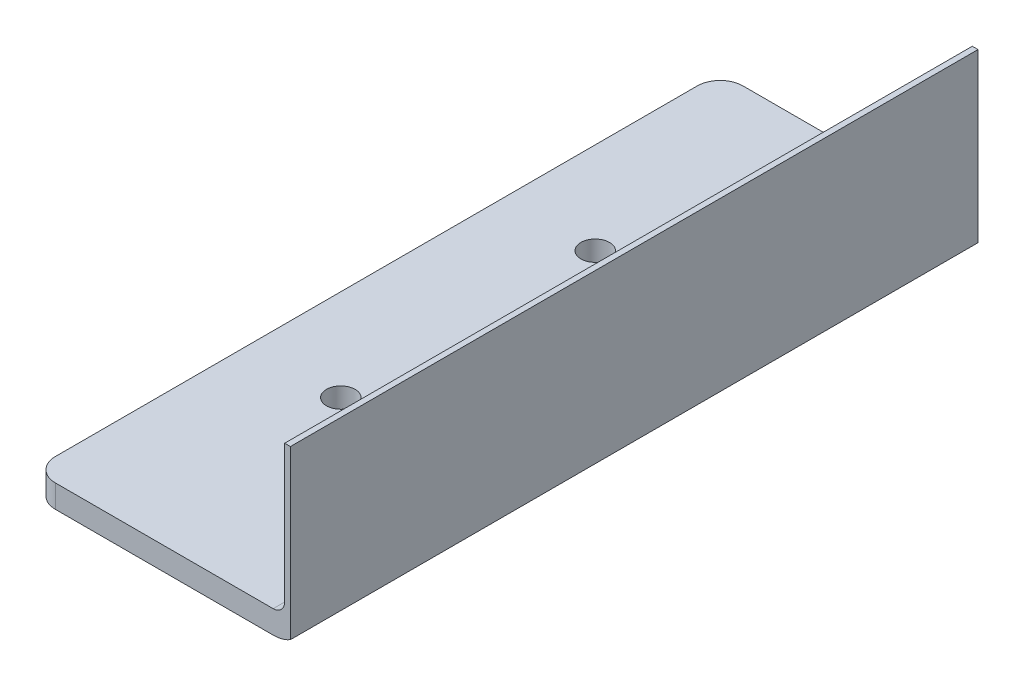
ISO-10303-21;
HEADER;
FILE_DESCRIPTION(('STEP AP214'),'2;1');
FILE_NAME('part.step','',(''),(''),'','','');
FILE_SCHEMA(('AUTOMOTIVE_DESIGN { 1 0 10303 214 1 1 1 1 }'));
ENDSEC;
DATA;
#1=APPLICATION_CONTEXT('core data for automotive mechanical design processes');
#2=APPLICATION_PROTOCOL_DEFINITION('international standard','automotive_design',2000,#1);
#3=PRODUCT_CONTEXT('',#1,'mechanical');
#4=PRODUCT('Part','Part','',(#3));
#5=PRODUCT_RELATED_PRODUCT_CATEGORY('part','',(#4));
#6=PRODUCT_DEFINITION_FORMATION('','',#4);
#7=PRODUCT_DEFINITION_CONTEXT('part definition',#1,'design');
#8=PRODUCT_DEFINITION('design','',#6,#7);
#9=PRODUCT_DEFINITION_SHAPE('','',#8);
#10=(LENGTH_UNIT() NAMED_UNIT(*) SI_UNIT(.MILLI.,.METRE.));
#11=(NAMED_UNIT(*) PLANE_ANGLE_UNIT() SI_UNIT($,.RADIAN.));
#12=(NAMED_UNIT(*) SI_UNIT($,.STERADIAN.) SOLID_ANGLE_UNIT());
#13=UNCERTAINTY_MEASURE_WITH_UNIT(LENGTH_MEASURE(1.E-05),#10,'distance_accuracy_value','');
#14=(GEOMETRIC_REPRESENTATION_CONTEXT(3) GLOBAL_UNCERTAINTY_ASSIGNED_CONTEXT((#13)) GLOBAL_UNIT_ASSIGNED_CONTEXT((#10,
#11,#12)) REPRESENTATION_CONTEXT('',''));
#15=CARTESIAN_POINT('',(0.,0.,0.));
#16=DIRECTION('',(0.,0.,1.));
#17=DIRECTION('',(1.,0.,0.));
#18=AXIS2_PLACEMENT_3D('',#15,#16,#17);
#19=CARTESIAN_POINT('',(1167.,870.,-830.));
#20=DIRECTION('',(-1.,0.,0.));
#21=DIRECTION('',(0.,-1.,0.));
#22=AXIS2_PLACEMENT_3D('',#19,#20,#21);
#23=PLANE('',#22);
#24=DIRECTION('',(0.,-1.,0.));
#25=VECTOR('',#24,1.);
#26=CARTESIAN_POINT('',(1167.,-789.500000000002,-340.000000000001));
#27=LINE('',#26,#25);
#28=CARTESIAN_POINT('',(1167.,-776.500000000002,-340.000000000001));
#29=VERTEX_POINT('',#28);
#30=CARTESIAN_POINT('',(1167.,-791.098076211355,-340.000000000001));
#31=VERTEX_POINT('',#30);
#32=EDGE_CURVE('E205',#29,#31,#27,.T.);
#33=ORIENTED_EDGE('',*,*,#32,.T.);
#34=DIRECTION('',(0.,0.,1.));
#35=VECTOR('',#34,1.);
#36=CARTESIAN_POINT('',(1167.,-791.098076211355,-340.000000000001));
#37=LINE('',#36,#35);
#38=CARTESIAN_POINT('',(1167.,-791.098076211355,-400.000000000001));
#39=VERTEX_POINT('',#38);
#40=EDGE_CURVE('E53',#31,#39,#37,.F.);
#41=ORIENTED_EDGE('',*,*,#40,.T.);
#42=DIRECTION('',(0.,1.,0.));
#43=VECTOR('',#42,1.);
#44=CARTESIAN_POINT('',(1167.,-789.500000000002,-400.000000000001));
#45=LINE('',#44,#43);
#46=CARTESIAN_POINT('',(1167.,-776.500000000002,-400.000000000001));
#47=VERTEX_POINT('',#46);
#48=EDGE_CURVE('E12',#39,#47,#45,.T.);
#49=ORIENTED_EDGE('',*,*,#48,.T.);
#50=DIRECTION('',(0.,0.,-1.));
#51=VECTOR('',#50,1.);
#52=CARTESIAN_POINT('',(1167.,-776.500000000002,-400.000000000001));
#53=LINE('',#52,#51);
#54=EDGE_CURVE('E48',#29,#47,#53,.T.);
#55=ORIENTED_EDGE('',*,*,#54,.F.);
#56=EDGE_LOOP('',(#33,#41,#49,#55));
#57=FACE_BOUND('',#56,.T.);
#58=ADVANCED_FACE('F45',(#57),#23,.F.);
#59=CARTESIAN_POINT('',(1165.5,-788.500000000001,-340.000000000001));
#60=DIRECTION('',(0.,0.,1.));
#61=DIRECTION('',(0.,-1.,0.));
#62=AXIS2_PLACEMENT_3D('',#59,#60,#61);
#63=CYLINDRICAL_SURFACE('',#62,0.99999999999989);
#64=DIRECTION('',(0.,0.,1.));
#65=VECTOR('',#64,1.);
#66=CARTESIAN_POINT('',(1166.5,-788.500000000001,-370.000000000001));
#67=LINE('',#66,#65);
#68=CARTESIAN_POINT('',(1166.5,-788.500000000001,-400.000000000001));
#69=VERTEX_POINT('',#68);
#70=CARTESIAN_POINT('',(1166.5,-788.500000000001,-340.000000000001));
#71=VERTEX_POINT('',#70);
#72=EDGE_CURVE('E152',#69,#71,#67,.T.);
#73=ORIENTED_EDGE('',*,*,#72,.F.);
#74=CARTESIAN_POINT('',(1165.5,-788.500000000001,-400.000000000001));
#75=DIRECTION('',(0.,0.,1.));
#76=DIRECTION('',(0.,-1.,0.));
#77=AXIS2_PLACEMENT_3D('',#74,#75,#76);
#78=CIRCLE('',#77,0.99999999999989);
#79=CARTESIAN_POINT('',(1165.5,-789.500000000002,-400.000000000001));
#80=VERTEX_POINT('',#79);
#81=EDGE_CURVE('E139',#80,#69,#78,.T.);
#82=ORIENTED_EDGE('',*,*,#81,.F.);
#83=DIRECTION('',(0.,0.,1.));
#84=VECTOR('',#83,1.);
#85=CARTESIAN_POINT('',(1165.5,-789.500000000002,-370.000000000001));
#86=LINE('',#85,#84);
#87=CARTESIAN_POINT('',(1165.5,-789.500000000002,-340.000000000001));
#88=VERTEX_POINT('',#87);
#89=EDGE_CURVE('E151',#88,#80,#86,.F.);
#90=ORIENTED_EDGE('',*,*,#89,.F.);
#91=CARTESIAN_POINT('',(1165.5,-788.500000000001,-340.000000000001));
#92=DIRECTION('',(0.,0.,1.));
#93=DIRECTION('',(0.,-1.,0.));
#94=AXIS2_PLACEMENT_3D('',#91,#92,#93);
#95=CIRCLE('',#94,0.99999999999989);
#96=EDGE_CURVE('E164',#71,#88,#95,.F.);
#97=ORIENTED_EDGE('',*,*,#96,.F.);
#98=EDGE_LOOP('',(#73,#82,#90,#97));
#99=FACE_BOUND('',#98,.T.);
#100=ADVANCED_FACE('F301',(#99),#63,.F.);
#101=CARTESIAN_POINT('',(1166.5,-791.500000000002,-370.000000000001));
#102=DIRECTION('',(-1.,0.,0.));
#103=DIRECTION('',(0.,-1.,0.));
#104=AXIS2_PLACEMENT_3D('',#101,#102,#103);
#105=PLANE('',#104);
#106=DIRECTION('',(0.,-1.,0.));
#107=VECTOR('',#106,1.);
#108=CARTESIAN_POINT('',(1166.5,-789.500000000002,-340.000000000001));
#109=LINE('',#108,#107);
#110=CARTESIAN_POINT('',(1166.5,-776.500000000002,-340.000000000001));
#111=VERTEX_POINT('',#110);
#112=EDGE_CURVE('E150',#111,#71,#109,.T.);
#113=ORIENTED_EDGE('',*,*,#112,.F.);
#114=DIRECTION('',(0.,0.,-1.));
#115=VECTOR('',#114,1.);
#116=CARTESIAN_POINT('',(1166.5,-776.500000000002,-400.000000000001));
#117=LINE('',#116,#115);
#118=CARTESIAN_POINT('',(1166.5,-776.500000000002,-400.000000000001));
#119=VERTEX_POINT('',#118);
#120=EDGE_CURVE('E147',#111,#119,#117,.T.);
#121=ORIENTED_EDGE('',*,*,#120,.T.);
#122=DIRECTION('',(0.,1.,0.));
#123=VECTOR('',#122,1.);
#124=CARTESIAN_POINT('',(1166.5,-789.500000000002,-400.000000000001));
#125=LINE('',#124,#123);
#126=EDGE_CURVE('E134',#69,#119,#125,.T.);
#127=ORIENTED_EDGE('',*,*,#126,.F.);
#128=ORIENTED_EDGE('',*,*,#72,.T.);
#129=EDGE_LOOP('',(#113,#121,#127,#128));
#130=FACE_BOUND('',#129,.T.);
#131=ADVANCED_FACE('F148',(#130),#105,.T.);
#132=CARTESIAN_POINT('',(1168.5,-776.500000000002,-400.000000000001));
#133=DIRECTION('',(0.,-1.,0.));
#134=DIRECTION('',(0.,0.,-1.));
#135=AXIS2_PLACEMENT_3D('',#132,#133,#134);
#136=PLANE('',#135);
#137=DIRECTION('',(1.,0.,0.));
#138=VECTOR('',#137,1.);
#139=CARTESIAN_POINT('',(1144.5,-776.500000000002,-340.000000000001));
#140=LINE('',#139,#138);
#141=EDGE_CURVE('E167',#29,#111,#140,.F.);
#142=ORIENTED_EDGE('',*,*,#141,.F.);
#143=ORIENTED_EDGE('',*,*,#54,.T.);
#144=DIRECTION('',(1.,0.,0.));
#145=VECTOR('',#144,1.);
#146=CARTESIAN_POINT('',(1144.5,-776.500000000002,-400.000000000001));
#147=LINE('',#146,#145);
#148=EDGE_CURVE('E137',#119,#47,#147,.T.);
#149=ORIENTED_EDGE('',*,*,#148,.F.);
#150=ORIENTED_EDGE('',*,*,#120,.F.);
#151=EDGE_LOOP('',(#142,#143,#149,#150));
#152=FACE_BOUND('',#151,.T.);
#153=ADVANCED_FACE('F154',(#152),#136,.F.);
#154=CARTESIAN_POINT('',(1155.5,-789.500000000002,-370.000000000001));
#155=DIRECTION('',(0.,1.,0.));
#156=DIRECTION('',(-1.,0.,0.));
#157=AXIS2_PLACEMENT_3D('',#154,#155,#156);
#158=PLANE('',#157);
#159=CARTESIAN_POINT('',(1162.8,-789.500000000002,-381.100000000001));
#160=DIRECTION('',(0.,-1.,0.));
#161=DIRECTION('',(1.,0.,0.));
#162=AXIS2_PLACEMENT_3D('',#159,#160,#161);
#163=CIRCLE('',#162,1.24999999999997);
#164=CARTESIAN_POINT('',(1164.05,-789.500000000002,-381.100000000001));
#165=VERTEX_POINT('',#164);
#166=EDGE_CURVE('E178',#165,#165,#163,.T.);
#167=ORIENTED_EDGE('',*,*,#166,.T.);
#168=EDGE_LOOP('',(#167));
#169=FACE_BOUND('',#168,.T.);
#170=CARTESIAN_POINT('',(1152.5,-789.500000000002,-358.900000000001));
#171=DIRECTION('',(0.,-1.,0.));
#172=DIRECTION('',(1.,0.,0.));
#173=AXIS2_PLACEMENT_3D('',#170,#171,#172);
#174=CIRCLE('',#173,1.24999999999997);
#175=CARTESIAN_POINT('',(1153.75,-789.500000000002,-358.900000000001));
#176=VERTEX_POINT('',#175);
#177=EDGE_CURVE('E184',#176,#176,#174,.T.);
#178=ORIENTED_EDGE('',*,*,#177,.T.);
#179=EDGE_LOOP('',(#178));
#180=FACE_BOUND('',#179,.T.);
#181=CARTESIAN_POINT('',(1152.5,-789.500000000002,-381.100000000001));
#182=DIRECTION('',(0.,-1.,0.));
#183=DIRECTION('',(1.,0.,0.));
#184=AXIS2_PLACEMENT_3D('',#181,#182,#183);
#185=CIRCLE('',#184,1.24999999999997);
#186=CARTESIAN_POINT('',(1153.75,-789.500000000002,-381.100000000001));
#187=VERTEX_POINT('',#186);
#188=EDGE_CURVE('E189',#187,#187,#185,.T.);
#189=ORIENTED_EDGE('',*,*,#188,.T.);
#190=EDGE_LOOP('',(#189));
#191=FACE_BOUND('',#190,.T.);
#192=CARTESIAN_POINT('',(1162.8,-789.500000000002,-358.900000000001));
#193=DIRECTION('',(0.,-1.,0.));
#194=DIRECTION('',(1.,0.,0.));
#195=AXIS2_PLACEMENT_3D('',#192,#193,#194);
#196=CIRCLE('',#195,1.24999999999997);
#197=CARTESIAN_POINT('',(1164.05,-789.500000000002,-358.900000000001));
#198=VERTEX_POINT('',#197);
#199=EDGE_CURVE('E192',#198,#198,#196,.T.);
#200=ORIENTED_EDGE('',*,*,#199,.T.);
#201=EDGE_LOOP('',(#200));
#202=FACE_BOUND('',#201,.T.);
#203=DIRECTION('',(1.,0.,0.));
#204=VECTOR('',#203,1.);
#205=CARTESIAN_POINT('',(1144.5,-789.500000000002,-400.000000000001));
#206=LINE('',#205,#204);
#207=CARTESIAN_POINT('',(1146.5,-789.500000000002,-400.000000000001));
#208=VERTEX_POINT('',#207);
#209=EDGE_CURVE('E143',#208,#80,#206,.T.);
#210=ORIENTED_EDGE('',*,*,#209,.F.);
#211=CARTESIAN_POINT('',(1146.5,-789.500000000002,-398.000000000001));
#212=DIRECTION('',(0.,-1.,0.));
#213=DIRECTION('',(1.,0.,0.));
#214=AXIS2_PLACEMENT_3D('',#211,#212,#213);
#215=CIRCLE('',#214,2.);
#216=CARTESIAN_POINT('',(1144.5,-789.500000000002,-398.000000000001));
#217=VERTEX_POINT('',#216);
#218=EDGE_CURVE('E196',#217,#208,#215,.T.);
#219=ORIENTED_EDGE('',*,*,#218,.F.);
#220=DIRECTION('',(0.,0.,1.));
#221=VECTOR('',#220,1.);
#222=CARTESIAN_POINT('',(1144.5,-789.500000000002,-400.000000000001));
#223=LINE('',#222,#221);
#224=CARTESIAN_POINT('',(1144.5,-789.500000000002,-342.000000000001));
#225=VERTEX_POINT('',#224);
#226=EDGE_CURVE('E160',#225,#217,#223,.F.);
#227=ORIENTED_EDGE('',*,*,#226,.F.);
#228=CARTESIAN_POINT('',(1146.5,-789.500000000002,-342.000000000001));
#229=DIRECTION('',(0.,-1.,0.));
#230=DIRECTION('',(1.,0.,0.));
#231=AXIS2_PLACEMENT_3D('',#228,#229,#230);
#232=CIRCLE('',#231,2.);
#233=CARTESIAN_POINT('',(1146.5,-789.500000000002,-340.000000000001));
#234=VERTEX_POINT('',#233);
#235=EDGE_CURVE('E200',#234,#225,#232,.T.);
#236=ORIENTED_EDGE('',*,*,#235,.F.);
#237=DIRECTION('',(1.,0.,0.));
#238=VECTOR('',#237,1.);
#239=CARTESIAN_POINT('',(1144.5,-789.500000000001,-340.000000000001));
#240=LINE('',#239,#238);
#241=EDGE_CURVE('E236',#88,#234,#240,.F.);
#242=ORIENTED_EDGE('',*,*,#241,.F.);
#243=ORIENTED_EDGE('',*,*,#89,.T.);
#244=EDGE_LOOP('',(#210,#219,#227,#236,#242,#243));
#245=FACE_BOUND('',#244,.T.);
#246=ADVANCED_FACE('F258',(#169,#180,#191,#202,#245),#158,.T.);
#247=CARTESIAN_POINT('',(1144.5,-789.500000000002,-400.000000000001));
#248=DIRECTION('',(-1.,0.,0.));
#249=DIRECTION('',(0.,-1.,0.));
#250=AXIS2_PLACEMENT_3D('',#247,#248,#249);
#251=PLANE('',#250);
#252=ORIENTED_EDGE('',*,*,#226,.T.);
#253=DIRECTION('',(0.,-1.,0.));
#254=VECTOR('',#253,1.);
#255=CARTESIAN_POINT('',(1144.5,-789.500000000002,-398.000000000001));
#256=LINE('',#255,#254);
#257=CARTESIAN_POINT('',(1144.5,-791.500000000002,-398.000000000001));
#258=VERTEX_POINT('',#257);
#259=EDGE_CURVE('E157',#258,#217,#256,.F.);
#260=ORIENTED_EDGE('',*,*,#259,.F.);
#261=DIRECTION('',(0.,0.,1.));
#262=VECTOR('',#261,1.);
#263=CARTESIAN_POINT('',(1144.5,-791.500000000002,-370.000000000001));
#264=LINE('',#263,#262);
#265=CARTESIAN_POINT('',(1144.5,-791.500000000002,-342.000000000001));
#266=VERTEX_POINT('',#265);
#267=EDGE_CURVE('E183',#258,#266,#264,.T.);
#268=ORIENTED_EDGE('',*,*,#267,.T.);
#269=DIRECTION('',(0.,-1.,0.));
#270=VECTOR('',#269,1.);
#271=CARTESIAN_POINT('',(1144.5,-789.500000000002,-342.000000000001));
#272=LINE('',#271,#270);
#273=EDGE_CURVE('E202',#225,#266,#272,.T.);
#274=ORIENTED_EDGE('',*,*,#273,.F.);
#275=EDGE_LOOP('',(#252,#260,#268,#274));
#276=FACE_BOUND('',#275,.T.);
#277=ADVANCED_FACE('F247',(#276),#251,.T.);
#278=CARTESIAN_POINT('',(1146.5,-789.500000000002,-342.000000000001));
#279=DIRECTION('',(0.,-1.,0.));
#280=DIRECTION('',(1.,0.,0.));
#281=AXIS2_PLACEMENT_3D('',#278,#279,#280);
#282=CYLINDRICAL_SURFACE('',#281,2.);
#283=ORIENTED_EDGE('',*,*,#235,.T.);
#284=ORIENTED_EDGE('',*,*,#273,.T.);
#285=CARTESIAN_POINT('',(1146.5,-791.500000000002,-342.000000000001));
#286=DIRECTION('',(0.,-1.,0.));
#287=DIRECTION('',(1.,0.,0.));
#288=AXIS2_PLACEMENT_3D('',#285,#286,#287);
#289=CIRCLE('',#288,2.);
#290=CARTESIAN_POINT('',(1146.5,-791.500000000002,-340.000000000001));
#291=VERTEX_POINT('',#290);
#292=EDGE_CURVE('E185',#266,#291,#289,.F.);
#293=ORIENTED_EDGE('',*,*,#292,.T.);
#294=DIRECTION('',(0.,-1.,0.));
#295=VECTOR('',#294,1.);
#296=CARTESIAN_POINT('',(1146.5,-789.500000000002,-340.000000000001));
#297=LINE('',#296,#295);
#298=EDGE_CURVE('E169',#234,#291,#297,.T.);
#299=ORIENTED_EDGE('',*,*,#298,.F.);
#300=EDGE_LOOP('',(#283,#284,#293,#299));
#301=FACE_BOUND('',#300,.T.);
#302=ADVANCED_FACE('F240',(#301),#282,.T.);
#303=CARTESIAN_POINT('',(1144.5,-789.500000000002,-340.000000000001));
#304=DIRECTION('',(0.,0.,1.));
#305=DIRECTION('',(0.,-1.,0.));
#306=AXIS2_PLACEMENT_3D('',#303,#304,#305);
#307=PLANE('',#306);
#308=ORIENTED_EDGE('',*,*,#32,.F.);
#309=ORIENTED_EDGE('',*,*,#141,.T.);
#310=ORIENTED_EDGE('',*,*,#112,.T.);
#311=ORIENTED_EDGE('',*,*,#96,.T.);
#312=ORIENTED_EDGE('',*,*,#241,.T.);
#313=ORIENTED_EDGE('',*,*,#298,.T.);
#314=DIRECTION('',(-1.,0.,0.));
#315=VECTOR('',#314,1.);
#316=CARTESIAN_POINT('',(1155.5,-791.500000000002,-340.000000000001));
#317=LINE('',#316,#315);
#318=CARTESIAN_POINT('',(1165.5,-791.500000000002,-340.000000000001));
#319=VERTEX_POINT('',#318);
#320=EDGE_CURVE('E215',#291,#319,#317,.F.);
#321=ORIENTED_EDGE('',*,*,#320,.T.);
#322=CARTESIAN_POINT('',(1165.5,-788.500000000001,-340.000000000001));
#323=DIRECTION('',(0.,0.,1.));
#324=DIRECTION('',(0.,-1.,0.));
#325=AXIS2_PLACEMENT_3D('',#322,#323,#324);
#326=CIRCLE('',#325,2.99999999999989);
#327=EDGE_CURVE('E198',#31,#319,#326,.F.);
#328=ORIENTED_EDGE('',*,*,#327,.F.);
#329=EDGE_LOOP('',(#308,#309,#310,#311,#312,#313,#321,#328));
#330=FACE_BOUND('',#329,.T.);
#331=ADVANCED_FACE('F213',(#330),#307,.T.);
#332=CARTESIAN_POINT('',(1165.5,-788.500000000001,-340.000000000001));
#333=DIRECTION('',(0.,0.,1.));
#334=DIRECTION('',(0.,-1.,0.));
#335=AXIS2_PLACEMENT_3D('',#332,#333,#334);
#336=CYLINDRICAL_SURFACE('',#335,2.99999999999989);
#337=ORIENTED_EDGE('',*,*,#40,.F.);
#338=ORIENTED_EDGE('',*,*,#327,.T.);
#339=DIRECTION('',(0.,0.,1.));
#340=VECTOR('',#339,1.);
#341=CARTESIAN_POINT('',(1165.5,-791.500000000002,-370.000000000001));
#342=LINE('',#341,#340);
#343=CARTESIAN_POINT('',(1165.5,-791.500000000002,-400.000000000001));
#344=VERTEX_POINT('',#343);
#345=EDGE_CURVE('E220',#319,#344,#342,.F.);
#346=ORIENTED_EDGE('',*,*,#345,.T.);
#347=CARTESIAN_POINT('',(1165.5,-788.500000000001,-400.000000000001));
#348=DIRECTION('',(0.,0.,1.));
#349=DIRECTION('',(0.,-1.,0.));
#350=AXIS2_PLACEMENT_3D('',#347,#348,#349);
#351=CIRCLE('',#350,2.99999999999989);
#352=EDGE_CURVE('E155',#39,#344,#351,.F.);
#353=ORIENTED_EDGE('',*,*,#352,.F.);
#354=EDGE_LOOP('',(#337,#338,#346,#353));
#355=FACE_BOUND('',#354,.T.);
#356=ADVANCED_FACE('F219',(#355),#336,.T.);
#357=CARTESIAN_POINT('',(1144.5,-789.500000000002,-400.000000000001));
#358=DIRECTION('',(0.,0.,-1.));
#359=DIRECTION('',(0.,1.,0.));
#360=AXIS2_PLACEMENT_3D('',#357,#358,#359);
#361=PLANE('',#360);
#362=ORIENTED_EDGE('',*,*,#48,.F.);
#363=ORIENTED_EDGE('',*,*,#352,.T.);
#364=DIRECTION('',(-1.,0.,0.));
#365=VECTOR('',#364,1.);
#366=CARTESIAN_POINT('',(1155.5,-791.500000000002,-400.000000000001));
#367=LINE('',#366,#365);
#368=CARTESIAN_POINT('',(1146.5,-791.500000000002,-400.000000000001));
#369=VERTEX_POINT('',#368);
#370=EDGE_CURVE('E228',#344,#369,#367,.T.);
#371=ORIENTED_EDGE('',*,*,#370,.T.);
#372=DIRECTION('',(0.,-1.,0.));
#373=VECTOR('',#372,1.);
#374=CARTESIAN_POINT('',(1146.5,-789.500000000002,-400.000000000001));
#375=LINE('',#374,#373);
#376=EDGE_CURVE('E195',#208,#369,#375,.T.);
#377=ORIENTED_EDGE('',*,*,#376,.F.);
#378=ORIENTED_EDGE('',*,*,#209,.T.);
#379=ORIENTED_EDGE('',*,*,#81,.T.);
#380=ORIENTED_EDGE('',*,*,#126,.T.);
#381=ORIENTED_EDGE('',*,*,#148,.T.);
#382=EDGE_LOOP('',(#362,#363,#371,#377,#378,#379,#380,#381));
#383=FACE_BOUND('',#382,.T.);
#384=ADVANCED_FACE('F136',(#383),#361,.T.);
#385=CARTESIAN_POINT('',(1146.5,-789.500000000002,-398.000000000001));
#386=DIRECTION('',(0.,-1.,0.));
#387=DIRECTION('',(1.,0.,0.));
#388=AXIS2_PLACEMENT_3D('',#385,#386,#387);
#389=CYLINDRICAL_SURFACE('',#388,2.);
#390=ORIENTED_EDGE('',*,*,#218,.T.);
#391=ORIENTED_EDGE('',*,*,#376,.T.);
#392=CARTESIAN_POINT('',(1146.5,-791.500000000002,-398.000000000001));
#393=DIRECTION('',(0.,-1.,0.));
#394=DIRECTION('',(1.,0.,0.));
#395=AXIS2_PLACEMENT_3D('',#392,#393,#394);
#396=CIRCLE('',#395,2.);
#397=EDGE_CURVE('E230',#369,#258,#396,.F.);
#398=ORIENTED_EDGE('',*,*,#397,.T.);
#399=ORIENTED_EDGE('',*,*,#259,.T.);
#400=EDGE_LOOP('',(#390,#391,#398,#399));
#401=FACE_BOUND('',#400,.T.);
#402=ADVANCED_FACE('F255',(#401),#389,.T.);
#403=CARTESIAN_POINT('',(1162.8,-791.500000000002,-358.900000000001));
#404=DIRECTION('',(0.,-1.,0.));
#405=DIRECTION('',(1.,0.,0.));
#406=AXIS2_PLACEMENT_3D('',#403,#404,#405);
#407=CYLINDRICAL_SURFACE('',#406,1.24999999999997);
#408=CARTESIAN_POINT('',(1162.8,-791.500000000002,-358.900000000001));
#409=DIRECTION('',(0.,-1.,0.));
#410=DIRECTION('',(1.,0.,0.));
#411=AXIS2_PLACEMENT_3D('',#408,#409,#410);
#412=CIRCLE('',#411,1.24999999999997);
#413=CARTESIAN_POINT('',(1164.05,-791.500000000002,-358.900000000001));
#414=VERTEX_POINT('',#413);
#415=EDGE_CURVE('E262',#414,#414,#412,.T.);
#416=ORIENTED_EDGE('',*,*,#415,.T.);
#417=EDGE_LOOP('',(#416));
#418=FACE_BOUND('',#417,.T.);
#419=ORIENTED_EDGE('',*,*,#199,.F.);
#420=EDGE_LOOP('',(#419));
#421=FACE_BOUND('',#420,.T.);
#422=ADVANCED_FACE('F283',(#418,#421),#407,.F.);
#423=CARTESIAN_POINT('',(1152.5,-791.500000000002,-381.100000000001));
#424=DIRECTION('',(0.,-1.,0.));
#425=DIRECTION('',(1.,0.,0.));
#426=AXIS2_PLACEMENT_3D('',#423,#424,#425);
#427=CYLINDRICAL_SURFACE('',#426,1.24999999999997);
#428=CARTESIAN_POINT('',(1152.5,-791.500000000002,-381.100000000001));
#429=DIRECTION('',(0.,-1.,0.));
#430=DIRECTION('',(1.,0.,0.));
#431=AXIS2_PLACEMENT_3D('',#428,#429,#430);
#432=CIRCLE('',#431,1.24999999999997);
#433=CARTESIAN_POINT('',(1153.75,-791.500000000002,-381.100000000001));
#434=VERTEX_POINT('',#433);
#435=EDGE_CURVE('E264',#434,#434,#432,.T.);
#436=ORIENTED_EDGE('',*,*,#435,.T.);
#437=EDGE_LOOP('',(#436));
#438=FACE_BOUND('',#437,.T.);
#439=ORIENTED_EDGE('',*,*,#188,.F.);
#440=EDGE_LOOP('',(#439));
#441=FACE_BOUND('',#440,.T.);
#442=ADVANCED_FACE('F286',(#438,#441),#427,.F.);
#443=CARTESIAN_POINT('',(1152.5,-791.500000000002,-358.900000000001));
#444=DIRECTION('',(0.,-1.,0.));
#445=DIRECTION('',(1.,0.,0.));
#446=AXIS2_PLACEMENT_3D('',#443,#444,#445);
#447=CYLINDRICAL_SURFACE('',#446,1.24999999999997);
#448=CARTESIAN_POINT('',(1152.5,-791.500000000002,-358.900000000001));
#449=DIRECTION('',(0.,-1.,0.));
#450=DIRECTION('',(1.,0.,0.));
#451=AXIS2_PLACEMENT_3D('',#448,#449,#450);
#452=CIRCLE('',#451,1.24999999999997);
#453=CARTESIAN_POINT('',(1153.75,-791.500000000002,-358.900000000001));
#454=VERTEX_POINT('',#453);
#455=EDGE_CURVE('E174',#454,#454,#452,.T.);
#456=ORIENTED_EDGE('',*,*,#455,.T.);
#457=EDGE_LOOP('',(#456));
#458=FACE_BOUND('',#457,.T.);
#459=ORIENTED_EDGE('',*,*,#177,.F.);
#460=EDGE_LOOP('',(#459));
#461=FACE_BOUND('',#460,.T.);
#462=ADVANCED_FACE('F272',(#458,#461),#447,.F.);
#463=CARTESIAN_POINT('',(1162.8,-791.500000000002,-381.100000000001));
#464=DIRECTION('',(0.,-1.,0.));
#465=DIRECTION('',(1.,0.,0.));
#466=AXIS2_PLACEMENT_3D('',#463,#464,#465);
#467=CYLINDRICAL_SURFACE('',#466,1.24999999999997);
#468=CARTESIAN_POINT('',(1162.8,-791.500000000002,-381.100000000001));
#469=DIRECTION('',(0.,-1.,0.));
#470=DIRECTION('',(1.,0.,0.));
#471=AXIS2_PLACEMENT_3D('',#468,#469,#470);
#472=CIRCLE('',#471,1.24999999999997);
#473=CARTESIAN_POINT('',(1164.05,-791.500000000002,-381.100000000001));
#474=VERTEX_POINT('',#473);
#475=EDGE_CURVE('E170',#474,#474,#472,.T.);
#476=ORIENTED_EDGE('',*,*,#475,.T.);
#477=EDGE_LOOP('',(#476));
#478=FACE_BOUND('',#477,.T.);
#479=ORIENTED_EDGE('',*,*,#166,.F.);
#480=EDGE_LOOP('',(#479));
#481=FACE_BOUND('',#480,.T.);
#482=ADVANCED_FACE('F277',(#478,#481),#467,.F.);
#483=CARTESIAN_POINT('',(1155.5,-791.500000000002,-370.000000000001));
#484=DIRECTION('',(0.,1.,0.));
#485=DIRECTION('',(-1.,0.,0.));
#486=AXIS2_PLACEMENT_3D('',#483,#484,#485);
#487=PLANE('',#486);
#488=ORIENTED_EDGE('',*,*,#475,.F.);
#489=EDGE_LOOP('',(#488));
#490=FACE_BOUND('',#489,.T.);
#491=ORIENTED_EDGE('',*,*,#455,.F.);
#492=EDGE_LOOP('',(#491));
#493=FACE_BOUND('',#492,.T.);
#494=ORIENTED_EDGE('',*,*,#435,.F.);
#495=EDGE_LOOP('',(#494));
#496=FACE_BOUND('',#495,.T.);
#497=ORIENTED_EDGE('',*,*,#415,.F.);
#498=EDGE_LOOP('',(#497));
#499=FACE_BOUND('',#498,.T.);
#500=ORIENTED_EDGE('',*,*,#370,.F.);
#501=ORIENTED_EDGE('',*,*,#345,.F.);
#502=ORIENTED_EDGE('',*,*,#320,.F.);
#503=ORIENTED_EDGE('',*,*,#292,.F.);
#504=ORIENTED_EDGE('',*,*,#267,.F.);
#505=ORIENTED_EDGE('',*,*,#397,.F.);
#506=EDGE_LOOP('',(#500,#501,#502,#503,#504,#505));
#507=FACE_BOUND('',#506,.T.);
#508=ADVANCED_FACE('F223',(#490,#493,#496,#499,#507),#487,.F.);
#509=CLOSED_SHELL('',(#58,#100,#131,#153,#246,#277,#302,#331,#356,#384,#402,#422,#442,#462,#482,#508));
#510=MANIFOLD_SOLID_BREP('B2',#509);
#511=ADVANCED_BREP_SHAPE_REPRESENTATION('',(#18,#510),#14);
#512=SHAPE_DEFINITION_REPRESENTATION(#9,#511);
ENDSEC;
END-ISO-10303-21;
